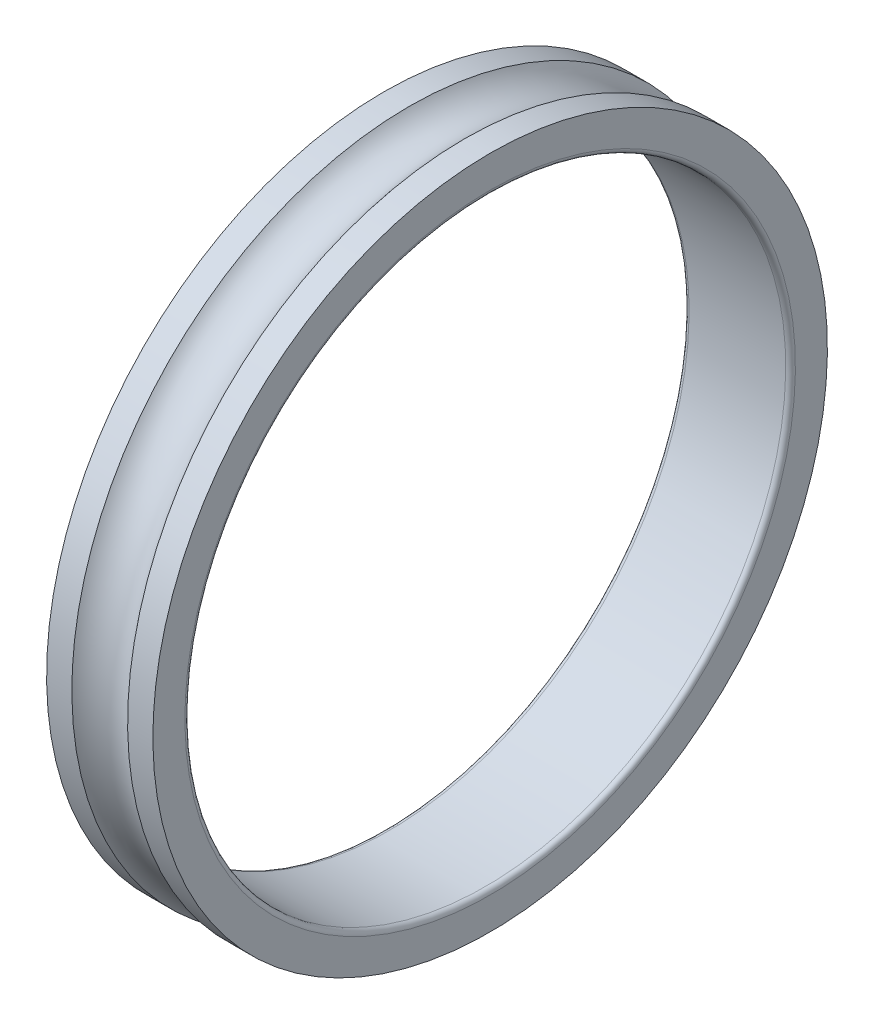
ISO-10303-21;
HEADER;
FILE_DESCRIPTION(('STEP AP214'),'2;1');
FILE_NAME('part.step','',(''),(''),'','','');
FILE_SCHEMA(('AUTOMOTIVE_DESIGN { 1 0 10303 214 1 1 1 1 }'));
ENDSEC;
DATA;
#1=APPLICATION_CONTEXT('core data for automotive mechanical design processes');
#2=APPLICATION_PROTOCOL_DEFINITION('international standard','automotive_design',2000,#1);
#3=PRODUCT_CONTEXT('',#1,'mechanical');
#4=PRODUCT('Part','Part','',(#3));
#5=PRODUCT_RELATED_PRODUCT_CATEGORY('part','',(#4));
#6=PRODUCT_DEFINITION_FORMATION('','',#4);
#7=PRODUCT_DEFINITION_CONTEXT('part definition',#1,'design');
#8=PRODUCT_DEFINITION('design','',#6,#7);
#9=PRODUCT_DEFINITION_SHAPE('','',#8);
#10=(LENGTH_UNIT() NAMED_UNIT(*) SI_UNIT(.MILLI.,.METRE.));
#11=(NAMED_UNIT(*) PLANE_ANGLE_UNIT() SI_UNIT($,.RADIAN.));
#12=(NAMED_UNIT(*) SI_UNIT($,.STERADIAN.) SOLID_ANGLE_UNIT());
#13=UNCERTAINTY_MEASURE_WITH_UNIT(LENGTH_MEASURE(1.E-05),#10,'distance_accuracy_value','');
#14=(GEOMETRIC_REPRESENTATION_CONTEXT(3) GLOBAL_UNCERTAINTY_ASSIGNED_CONTEXT((#13)) GLOBAL_UNIT_ASSIGNED_CONTEXT((#10,
#11,#12)) REPRESENTATION_CONTEXT('',''));
#15=CARTESIAN_POINT('',(0.,0.,0.));
#16=DIRECTION('',(0.,0.,1.));
#17=DIRECTION('',(1.,0.,0.));
#18=AXIS2_PLACEMENT_3D('',#15,#16,#17);
#19=CARTESIAN_POINT('',(40.5318749365351,0.,0.));
#20=DIRECTION('',(-1.,0.,0.));
#21=DIRECTION('',(0.,1.,0.));
#22=AXIS2_PLACEMENT_3D('',#19,#20,#21);
#23=CYLINDRICAL_SURFACE('',#22,145.95);
#24=CARTESIAN_POINT('',(35.0637498730702,0.,0.));
#25=DIRECTION('',(1.,0.,0.));
#26=DIRECTION('',(0.,1.,0.));
#27=AXIS2_PLACEMENT_3D('',#24,#25,#26);
#28=CIRCLE('',#27,145.95);
#29=CARTESIAN_POINT('',(35.0637498730702,145.95,0.));
#30=VERTEX_POINT('',#29);
#31=EDGE_CURVE('E11',#30,#30,#28,.T.);
#32=ORIENTED_EDGE('',*,*,#31,.T.);
#33=EDGE_LOOP('',(#32));
#34=FACE_BOUND('',#33,.T.);
#35=CARTESIAN_POINT('',(46.,0.,0.));
#36=DIRECTION('',(1.,0.,0.));
#37=DIRECTION('',(0.,1.,0.));
#38=AXIS2_PLACEMENT_3D('',#35,#36,#37);
#39=CIRCLE('',#38,145.95);
#40=CARTESIAN_POINT('',(46.,145.95,0.));
#41=VERTEX_POINT('',#40);
#42=EDGE_CURVE('E57',#41,#41,#39,.T.);
#43=ORIENTED_EDGE('',*,*,#42,.F.);
#44=EDGE_LOOP('',(#43));
#45=FACE_BOUND('',#44,.T.);
#46=ADVANCED_FACE('F17',(#34,#45),#23,.T.);
#47=CARTESIAN_POINT('',(23.,0.,0.));
#48=DIRECTION('',(1.,0.,0.));
#49=DIRECTION('',(0.,0.,-1.));
#50=AXIS2_PLACEMENT_3D('',#47,#48,#49);
#51=TOROIDAL_SURFACE('',#50,155.,15.081);
#52=CARTESIAN_POINT('',(10.9362501269298,0.,0.));
#53=DIRECTION('',(1.,0.,0.));
#54=DIRECTION('',(0.,1.,0.));
#55=AXIS2_PLACEMENT_3D('',#52,#53,#54);
#56=CIRCLE('',#55,145.95);
#57=CARTESIAN_POINT('',(10.9362501269298,145.95,0.));
#58=VERTEX_POINT('',#57);
#59=EDGE_CURVE('E27',#58,#58,#56,.T.);
#60=ORIENTED_EDGE('',*,*,#59,.T.);
#61=EDGE_LOOP('',(#60));
#62=FACE_BOUND('',#61,.T.);
#63=ORIENTED_EDGE('',*,*,#31,.F.);
#64=EDGE_LOOP('',(#63));
#65=FACE_BOUND('',#64,.T.);
#66=ADVANCED_FACE('F79',(#62,#65),#51,.F.);
#67=CARTESIAN_POINT('',(5.4681250634649,0.,0.));
#68=DIRECTION('',(-1.,0.,0.));
#69=DIRECTION('',(0.,1.,0.));
#70=AXIS2_PLACEMENT_3D('',#67,#68,#69);
#71=CYLINDRICAL_SURFACE('',#70,145.95);
#72=CARTESIAN_POINT('',(0.,0.,0.));
#73=DIRECTION('',(1.,0.,0.));
#74=DIRECTION('',(0.,1.,0.));
#75=AXIS2_PLACEMENT_3D('',#72,#73,#74);
#76=CIRCLE('',#75,145.95);
#77=CARTESIAN_POINT('',(0.,145.95,0.));
#78=VERTEX_POINT('',#77);
#79=EDGE_CURVE('E21',#78,#78,#76,.T.);
#80=ORIENTED_EDGE('',*,*,#79,.T.);
#81=EDGE_LOOP('',(#80));
#82=FACE_BOUND('',#81,.T.);
#83=ORIENTED_EDGE('',*,*,#59,.F.);
#84=EDGE_LOOP('',(#83));
#85=FACE_BOUND('',#84,.T.);
#86=ADVANCED_FACE('F83',(#82,#85),#71,.T.);
#87=CARTESIAN_POINT('',(0.,139.025,0.));
#88=DIRECTION('',(-1.,0.,0.));
#89=DIRECTION('',(0.,-1.,0.));
#90=AXIS2_PLACEMENT_3D('',#87,#88,#89);
#91=PLANE('',#90);
#92=CARTESIAN_POINT('',(0.,0.,0.));
#93=DIRECTION('',(1.,0.,0.));
#94=DIRECTION('',(0.,1.,0.));
#95=AXIS2_PLACEMENT_3D('',#92,#93,#94);
#96=CIRCLE('',#95,132.1);
#97=CARTESIAN_POINT('',(0.,132.1,0.));
#98=VERTEX_POINT('',#97);
#99=EDGE_CURVE('E59',#98,#98,#96,.T.);
#100=ORIENTED_EDGE('',*,*,#99,.T.);
#101=EDGE_LOOP('',(#100));
#102=FACE_BOUND('',#101,.T.);
#103=ORIENTED_EDGE('',*,*,#79,.F.);
#104=EDGE_LOOP('',(#103));
#105=FACE_BOUND('',#104,.T.);
#106=ADVANCED_FACE('F19',(#102,#105),#91,.T.);
#107=CARTESIAN_POINT('',(2.1,0.,0.));
#108=DIRECTION('',(1.,0.,0.));
#109=DIRECTION('',(0.,0.,-1.));
#110=AXIS2_PLACEMENT_3D('',#107,#108,#109);
#111=TOROIDAL_SURFACE('',#110,132.1,2.1);
#112=CARTESIAN_POINT('',(2.1,0.,0.));
#113=DIRECTION('',(1.,0.,0.));
#114=DIRECTION('',(0.,1.,0.));
#115=AXIS2_PLACEMENT_3D('',#112,#113,#114);
#116=CIRCLE('',#115,130.);
#117=CARTESIAN_POINT('',(2.1,130.,0.));
#118=VERTEX_POINT('',#117);
#119=EDGE_CURVE('E56',#118,#118,#116,.T.);
#120=ORIENTED_EDGE('',*,*,#119,.T.);
#121=EDGE_LOOP('',(#120));
#122=FACE_BOUND('',#121,.T.);
#123=ORIENTED_EDGE('',*,*,#99,.F.);
#124=EDGE_LOOP('',(#123));
#125=FACE_BOUND('',#124,.T.);
#126=ADVANCED_FACE('F91',(#122,#125),#111,.T.);
#127=CARTESIAN_POINT('',(23.,0.,0.));
#128=DIRECTION('',(-1.,0.,0.));
#129=DIRECTION('',(0.,1.,0.));
#130=AXIS2_PLACEMENT_3D('',#127,#128,#129);
#131=CYLINDRICAL_SURFACE('',#130,130.);
#132=CARTESIAN_POINT('',(43.9,0.,0.));
#133=DIRECTION('',(1.,0.,0.));
#134=DIRECTION('',(0.,1.,0.));
#135=AXIS2_PLACEMENT_3D('',#132,#133,#134);
#136=CIRCLE('',#135,130.);
#137=CARTESIAN_POINT('',(43.9,130.,0.));
#138=VERTEX_POINT('',#137);
#139=EDGE_CURVE('E52',#138,#138,#136,.T.);
#140=ORIENTED_EDGE('',*,*,#139,.T.);
#141=EDGE_LOOP('',(#140));
#142=FACE_BOUND('',#141,.T.);
#143=ORIENTED_EDGE('',*,*,#119,.F.);
#144=EDGE_LOOP('',(#143));
#145=FACE_BOUND('',#144,.T.);
#146=ADVANCED_FACE('F53',(#142,#145),#131,.F.);
#147=CARTESIAN_POINT('',(43.9,0.,0.));
#148=DIRECTION('',(1.,0.,0.));
#149=DIRECTION('',(0.,0.,-1.));
#150=AXIS2_PLACEMENT_3D('',#147,#148,#149);
#151=TOROIDAL_SURFACE('',#150,132.1,2.1);
#152=CARTESIAN_POINT('',(46.,0.,0.));
#153=DIRECTION('',(1.,0.,0.));
#154=DIRECTION('',(0.,1.,0.));
#155=AXIS2_PLACEMENT_3D('',#152,#153,#154);
#156=CIRCLE('',#155,132.1);
#157=CARTESIAN_POINT('',(46.,132.1,0.));
#158=VERTEX_POINT('',#157);
#159=EDGE_CURVE('E60',#158,#158,#156,.T.);
#160=ORIENTED_EDGE('',*,*,#159,.T.);
#161=EDGE_LOOP('',(#160));
#162=FACE_BOUND('',#161,.T.);
#163=ORIENTED_EDGE('',*,*,#139,.F.);
#164=EDGE_LOOP('',(#163));
#165=FACE_BOUND('',#164,.T.);
#166=ADVANCED_FACE('F67',(#162,#165),#151,.T.);
#167=CARTESIAN_POINT('',(46.,139.025,0.));
#168=DIRECTION('',(1.,0.,0.));
#169=DIRECTION('',(0.,1.,0.));
#170=AXIS2_PLACEMENT_3D('',#167,#168,#169);
#171=PLANE('',#170);
#172=ORIENTED_EDGE('',*,*,#42,.T.);
#173=EDGE_LOOP('',(#172));
#174=FACE_BOUND('',#173,.T.);
#175=ORIENTED_EDGE('',*,*,#159,.F.);
#176=EDGE_LOOP('',(#175));
#177=FACE_BOUND('',#176,.T.);
#178=ADVANCED_FACE('F69',(#174,#177),#171,.T.);
#179=CLOSED_SHELL('',(#46,#66,#86,#106,#126,#146,#166,#178));
#180=MANIFOLD_SOLID_BREP('B1',#179);
#181=ADVANCED_BREP_SHAPE_REPRESENTATION('',(#18,#180),#14);
#182=SHAPE_DEFINITION_REPRESENTATION(#9,#181);
ENDSEC;
END-ISO-10303-21;
